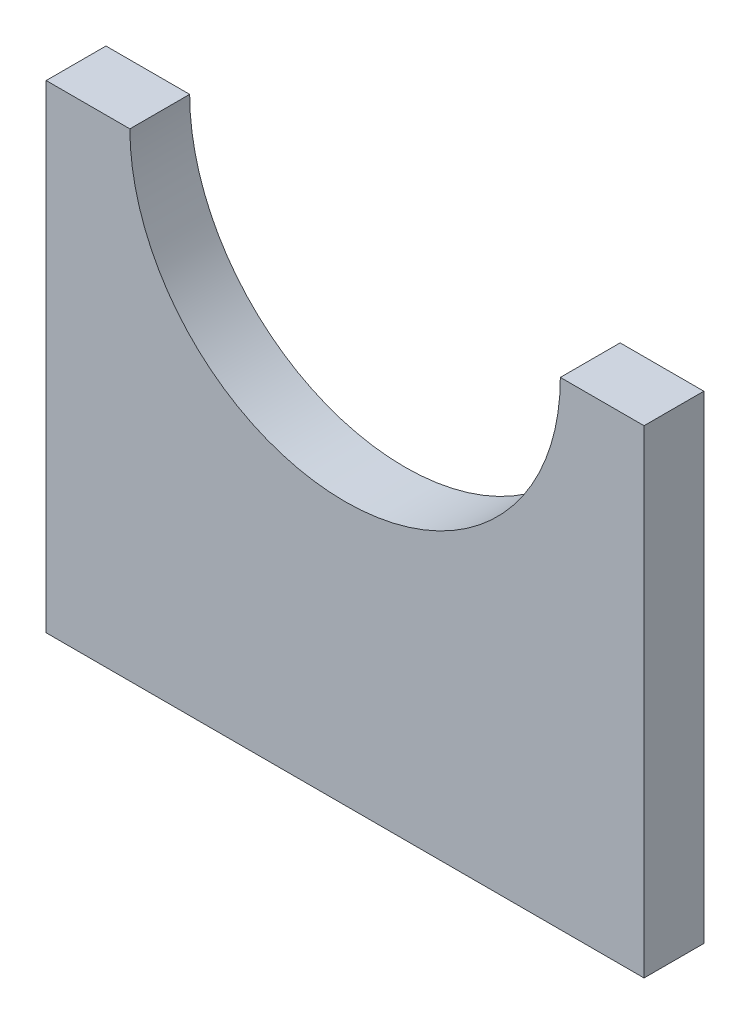
ISO-10303-21;
HEADER;
FILE_DESCRIPTION(('STEP AP214'),'2;1');
FILE_NAME('part.step','',(''),(''),'','','');
FILE_SCHEMA(('AUTOMOTIVE_DESIGN { 1 0 10303 214 1 1 1 1 }'));
ENDSEC;
DATA;
#1=APPLICATION_CONTEXT('core data for automotive mechanical design processes');
#2=APPLICATION_PROTOCOL_DEFINITION('international standard','automotive_design',2000,#1);
#3=PRODUCT_CONTEXT('',#1,'mechanical');
#4=PRODUCT('Part','Part','',(#3));
#5=PRODUCT_RELATED_PRODUCT_CATEGORY('part','',(#4));
#6=PRODUCT_DEFINITION_FORMATION('','',#4);
#7=PRODUCT_DEFINITION_CONTEXT('part definition',#1,'design');
#8=PRODUCT_DEFINITION('design','',#6,#7);
#9=PRODUCT_DEFINITION_SHAPE('','',#8);
#10=(LENGTH_UNIT() NAMED_UNIT(*) SI_UNIT(.MILLI.,.METRE.));
#11=(NAMED_UNIT(*) PLANE_ANGLE_UNIT() SI_UNIT($,.RADIAN.));
#12=(NAMED_UNIT(*) SI_UNIT($,.STERADIAN.) SOLID_ANGLE_UNIT());
#13=UNCERTAINTY_MEASURE_WITH_UNIT(LENGTH_MEASURE(1.E-05),#10,'distance_accuracy_value','');
#14=(GEOMETRIC_REPRESENTATION_CONTEXT(3) GLOBAL_UNCERTAINTY_ASSIGNED_CONTEXT((#13)) GLOBAL_UNIT_ASSIGNED_CONTEXT((#10,
#11,#12)) REPRESENTATION_CONTEXT('',''));
#15=CARTESIAN_POINT('',(0.,0.,0.));
#16=DIRECTION('',(0.,0.,1.));
#17=DIRECTION('',(1.,0.,0.));
#18=AXIS2_PLACEMENT_3D('',#15,#16,#17);
#19=CARTESIAN_POINT('',(-25.,0.,2.5));
#20=DIRECTION('',(0.,-1.,0.));
#21=DIRECTION('',(1.,0.,0.));
#22=AXIS2_PLACEMENT_3D('',#19,#20,#21);
#23=PLANE('',#22);
#24=DIRECTION('',(-1.,0.,0.));
#25=VECTOR('',#24,1.);
#26=CARTESIAN_POINT('',(-25.,0.,-2.5));
#27=LINE('',#26,#25);
#28=CARTESIAN_POINT('',(-18.,0.,-2.5));
#29=VERTEX_POINT('',#28);
#30=CARTESIAN_POINT('',(-25.,0.,-2.5));
#31=VERTEX_POINT('',#30);
#32=EDGE_CURVE('E117',#29,#31,#27,.T.);
#33=ORIENTED_EDGE('',*,*,#32,.T.);
#34=DIRECTION('',(0.,0.,-1.));
#35=VECTOR('',#34,1.);
#36=CARTESIAN_POINT('',(-25.,0.,2.5));
#37=LINE('',#36,#35);
#38=CARTESIAN_POINT('',(-25.,0.,2.5));
#39=VERTEX_POINT('',#38);
#40=EDGE_CURVE('E11',#39,#31,#37,.T.);
#41=ORIENTED_EDGE('',*,*,#40,.F.);
#42=DIRECTION('',(-1.,0.,0.));
#43=VECTOR('',#42,1.);
#44=CARTESIAN_POINT('',(-25.,0.,2.5));
#45=LINE('',#44,#43);
#46=CARTESIAN_POINT('',(-18.,0.,2.5));
#47=VERTEX_POINT('',#46);
#48=EDGE_CURVE('E127',#47,#39,#45,.T.);
#49=ORIENTED_EDGE('',*,*,#48,.F.);
#50=DIRECTION('',(0.,0.,-1.));
#51=VECTOR('',#50,1.);
#52=CARTESIAN_POINT('',(-18.,0.,2.5));
#53=LINE('',#52,#51);
#54=EDGE_CURVE('E113',#47,#29,#53,.T.);
#55=ORIENTED_EDGE('',*,*,#54,.T.);
#56=EDGE_LOOP('',(#33,#41,#49,#55));
#57=FACE_BOUND('',#56,.T.);
#58=ADVANCED_FACE('F33',(#57),#23,.F.);
#59=CARTESIAN_POINT('',(-25.,0.,2.5));
#60=DIRECTION('',(1.,0.,0.));
#61=DIRECTION('',(0.,1.,0.));
#62=AXIS2_PLACEMENT_3D('',#59,#60,#61);
#63=PLANE('',#62);
#64=DIRECTION('',(0.,-1.,0.));
#65=VECTOR('',#64,1.);
#66=CARTESIAN_POINT('',(-25.,0.,-2.5));
#67=LINE('',#66,#65);
#68=CARTESIAN_POINT('',(-25.,-40.,-2.5));
#69=VERTEX_POINT('',#68);
#70=EDGE_CURVE('E120',#31,#69,#67,.T.);
#71=ORIENTED_EDGE('',*,*,#70,.T.);
#72=DIRECTION('',(0.,0.,-1.));
#73=VECTOR('',#72,1.);
#74=CARTESIAN_POINT('',(-25.,-40.,2.5));
#75=LINE('',#74,#73);
#76=CARTESIAN_POINT('',(-25.,-40.,2.5));
#77=VERTEX_POINT('',#76);
#78=EDGE_CURVE('E41',#77,#69,#75,.T.);
#79=ORIENTED_EDGE('',*,*,#78,.F.);
#80=DIRECTION('',(0.,-1.,0.));
#81=VECTOR('',#80,1.);
#82=CARTESIAN_POINT('',(-25.,0.,2.5));
#83=LINE('',#82,#81);
#84=EDGE_CURVE('E86',#39,#77,#83,.T.);
#85=ORIENTED_EDGE('',*,*,#84,.F.);
#86=ORIENTED_EDGE('',*,*,#40,.T.);
#87=EDGE_LOOP('',(#71,#79,#85,#86));
#88=FACE_BOUND('',#87,.T.);
#89=ADVANCED_FACE('F151',(#88),#63,.F.);
#90=CARTESIAN_POINT('',(-25.,-40.,2.5));
#91=DIRECTION('',(0.,1.,0.));
#92=DIRECTION('',(-1.,0.,0.));
#93=AXIS2_PLACEMENT_3D('',#90,#91,#92);
#94=PLANE('',#93);
#95=DIRECTION('',(1.,0.,0.));
#96=VECTOR('',#95,1.);
#97=CARTESIAN_POINT('',(-25.,-40.,-2.5));
#98=LINE('',#97,#96);
#99=CARTESIAN_POINT('',(25.,-40.,-2.5));
#100=VERTEX_POINT('',#99);
#101=EDGE_CURVE('E122',#69,#100,#98,.T.);
#102=ORIENTED_EDGE('',*,*,#101,.T.);
#103=DIRECTION('',(0.,0.,-1.));
#104=VECTOR('',#103,1.);
#105=CARTESIAN_POINT('',(25.,-40.,2.5));
#106=LINE('',#105,#104);
#107=CARTESIAN_POINT('',(25.,-40.,2.5));
#108=VERTEX_POINT('',#107);
#109=EDGE_CURVE('E108',#108,#100,#106,.T.);
#110=ORIENTED_EDGE('',*,*,#109,.F.);
#111=DIRECTION('',(1.,0.,0.));
#112=VECTOR('',#111,1.);
#113=CARTESIAN_POINT('',(-25.,-40.,2.5));
#114=LINE('',#113,#112);
#115=EDGE_CURVE('E99',#77,#108,#114,.T.);
#116=ORIENTED_EDGE('',*,*,#115,.F.);
#117=ORIENTED_EDGE('',*,*,#78,.T.);
#118=EDGE_LOOP('',(#102,#110,#116,#117));
#119=FACE_BOUND('',#118,.T.);
#120=ADVANCED_FACE('F133',(#119),#94,.F.);
#121=CARTESIAN_POINT('',(25.,-40.,2.5));
#122=DIRECTION('',(-1.,0.,0.));
#123=DIRECTION('',(0.,-1.,0.));
#124=AXIS2_PLACEMENT_3D('',#121,#122,#123);
#125=PLANE('',#124);
#126=DIRECTION('',(0.,1.,0.));
#127=VECTOR('',#126,1.);
#128=CARTESIAN_POINT('',(25.,-40.,-2.5));
#129=LINE('',#128,#127);
#130=CARTESIAN_POINT('',(25.,0.,-2.5));
#131=VERTEX_POINT('',#130);
#132=EDGE_CURVE('E107',#100,#131,#129,.T.);
#133=ORIENTED_EDGE('',*,*,#132,.T.);
#134=DIRECTION('',(0.,0.,-1.));
#135=VECTOR('',#134,1.);
#136=CARTESIAN_POINT('',(25.,0.,2.5));
#137=LINE('',#136,#135);
#138=CARTESIAN_POINT('',(25.,0.,2.5));
#139=VERTEX_POINT('',#138);
#140=EDGE_CURVE('E104',#139,#131,#137,.T.);
#141=ORIENTED_EDGE('',*,*,#140,.F.);
#142=DIRECTION('',(0.,1.,0.));
#143=VECTOR('',#142,1.);
#144=CARTESIAN_POINT('',(25.,-40.,2.5));
#145=LINE('',#144,#143);
#146=EDGE_CURVE('E93',#108,#139,#145,.T.);
#147=ORIENTED_EDGE('',*,*,#146,.F.);
#148=ORIENTED_EDGE('',*,*,#109,.T.);
#149=EDGE_LOOP('',(#133,#141,#147,#148));
#150=FACE_BOUND('',#149,.T.);
#151=ADVANCED_FACE('F105',(#150),#125,.F.);
#152=CARTESIAN_POINT('',(18.,0.,2.5));
#153=DIRECTION('',(0.,-1.,0.));
#154=DIRECTION('',(1.,0.,0.));
#155=AXIS2_PLACEMENT_3D('',#152,#153,#154);
#156=PLANE('',#155);
#157=DIRECTION('',(-1.,0.,0.));
#158=VECTOR('',#157,1.);
#159=CARTESIAN_POINT('',(18.,0.,-2.5));
#160=LINE('',#159,#158);
#161=CARTESIAN_POINT('',(18.,0.,-2.5));
#162=VERTEX_POINT('',#161);
#163=EDGE_CURVE('E72',#131,#162,#160,.T.);
#164=ORIENTED_EDGE('',*,*,#163,.T.);
#165=DIRECTION('',(0.,0.,-1.));
#166=VECTOR('',#165,1.);
#167=CARTESIAN_POINT('',(18.,0.,2.5));
#168=LINE('',#167,#166);
#169=CARTESIAN_POINT('',(18.,0.,2.5));
#170=VERTEX_POINT('',#169);
#171=EDGE_CURVE('E109',#170,#162,#168,.T.);
#172=ORIENTED_EDGE('',*,*,#171,.F.);
#173=DIRECTION('',(-1.,0.,0.));
#174=VECTOR('',#173,1.);
#175=CARTESIAN_POINT('',(18.,0.,2.5));
#176=LINE('',#175,#174);
#177=EDGE_CURVE('E97',#139,#170,#176,.T.);
#178=ORIENTED_EDGE('',*,*,#177,.F.);
#179=ORIENTED_EDGE('',*,*,#140,.T.);
#180=EDGE_LOOP('',(#164,#172,#178,#179));
#181=FACE_BOUND('',#180,.T.);
#182=ADVANCED_FACE('F111',(#181),#156,.F.);
#183=CARTESIAN_POINT('',(0.,0.,2.5));
#184=DIRECTION('',(0.,0.,-1.));
#185=DIRECTION('',(-1.,0.,0.));
#186=AXIS2_PLACEMENT_3D('',#183,#184,#185);
#187=CYLINDRICAL_SURFACE('',#186,18.);
#188=CARTESIAN_POINT('',(0.,0.,-2.5));
#189=DIRECTION('',(0.,0.,-1.));
#190=DIRECTION('',(1.,0.,0.));
#191=AXIS2_PLACEMENT_3D('',#188,#189,#190);
#192=CIRCLE('',#191,18.);
#193=EDGE_CURVE('E78',#162,#29,#192,.T.);
#194=ORIENTED_EDGE('',*,*,#193,.T.);
#195=ORIENTED_EDGE('',*,*,#54,.F.);
#196=CARTESIAN_POINT('',(0.,0.,2.5));
#197=DIRECTION('',(0.,0.,-1.));
#198=DIRECTION('',(1.,0.,0.));
#199=AXIS2_PLACEMENT_3D('',#196,#197,#198);
#200=CIRCLE('',#199,18.);
#201=EDGE_CURVE('E49',#170,#47,#200,.T.);
#202=ORIENTED_EDGE('',*,*,#201,.F.);
#203=ORIENTED_EDGE('',*,*,#171,.T.);
#204=EDGE_LOOP('',(#194,#195,#202,#203));
#205=FACE_BOUND('',#204,.T.);
#206=ADVANCED_FACE('F140',(#205),#187,.F.);
#207=CARTESIAN_POINT('',(0.,0.,2.5));
#208=DIRECTION('',(0.,0.,1.));
#209=DIRECTION('',(1.,0.,0.));
#210=AXIS2_PLACEMENT_3D('',#207,#208,#209);
#211=PLANE('',#210);
#212=ORIENTED_EDGE('',*,*,#48,.T.);
#213=ORIENTED_EDGE('',*,*,#84,.T.);
#214=ORIENTED_EDGE('',*,*,#115,.T.);
#215=ORIENTED_EDGE('',*,*,#146,.T.);
#216=ORIENTED_EDGE('',*,*,#177,.T.);
#217=ORIENTED_EDGE('',*,*,#201,.T.);
#218=EDGE_LOOP('',(#212,#213,#214,#215,#216,#217));
#219=FACE_BOUND('',#218,.T.);
#220=ADVANCED_FACE('F95',(#219),#211,.T.);
#221=CARTESIAN_POINT('',(0.,0.,-2.5));
#222=DIRECTION('',(0.,0.,1.));
#223=DIRECTION('',(1.,0.,0.));
#224=AXIS2_PLACEMENT_3D('',#221,#222,#223);
#225=PLANE('',#224);
#226=ORIENTED_EDGE('',*,*,#32,.F.);
#227=ORIENTED_EDGE('',*,*,#193,.F.);
#228=ORIENTED_EDGE('',*,*,#163,.F.);
#229=ORIENTED_EDGE('',*,*,#132,.F.);
#230=ORIENTED_EDGE('',*,*,#101,.F.);
#231=ORIENTED_EDGE('',*,*,#70,.F.);
#232=EDGE_LOOP('',(#226,#227,#228,#229,#230,#231));
#233=FACE_BOUND('',#232,.T.);
#234=ADVANCED_FACE('F136',(#233),#225,.F.);
#235=CLOSED_SHELL('',(#58,#89,#120,#151,#182,#206,#220,#234));
#236=MANIFOLD_SOLID_BREP('B2',#235);
#237=ADVANCED_BREP_SHAPE_REPRESENTATION('',(#18,#236),#14);
#238=SHAPE_DEFINITION_REPRESENTATION(#9,#237);
ENDSEC;
END-ISO-10303-21;
